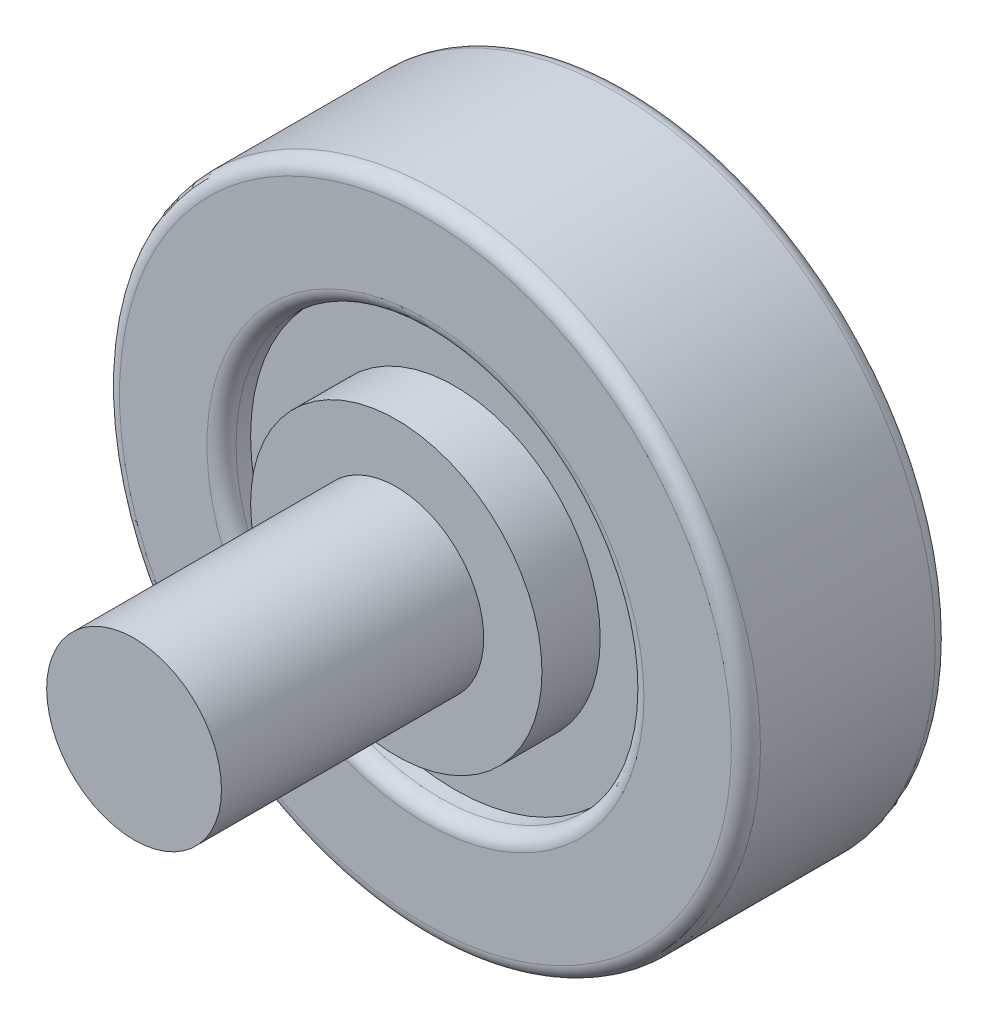
ISO-10303-21;
HEADER;
FILE_DESCRIPTION(('STEP AP214'),'2;1');
FILE_NAME('part.step','',(''),(''),'','','');
FILE_SCHEMA(('AUTOMOTIVE_DESIGN { 1 0 10303 214 1 1 1 1 }'));
ENDSEC;
DATA;
#1=APPLICATION_CONTEXT('core data for automotive mechanical design processes');
#2=APPLICATION_PROTOCOL_DEFINITION('international standard','automotive_design',2000,#1);
#3=PRODUCT_CONTEXT('',#1,'mechanical');
#4=PRODUCT('Part','Part','',(#3));
#5=PRODUCT_RELATED_PRODUCT_CATEGORY('part','',(#4));
#6=PRODUCT_DEFINITION_FORMATION('','',#4);
#7=PRODUCT_DEFINITION_CONTEXT('part definition',#1,'design');
#8=PRODUCT_DEFINITION('design','',#6,#7);
#9=PRODUCT_DEFINITION_SHAPE('','',#8);
#10=(LENGTH_UNIT() NAMED_UNIT(*) SI_UNIT(.MILLI.,.METRE.));
#11=(NAMED_UNIT(*) PLANE_ANGLE_UNIT() SI_UNIT($,.RADIAN.));
#12=(NAMED_UNIT(*) SI_UNIT($,.STERADIAN.) SOLID_ANGLE_UNIT());
#13=UNCERTAINTY_MEASURE_WITH_UNIT(LENGTH_MEASURE(1.E-05),#10,'distance_accuracy_value','');
#14=(GEOMETRIC_REPRESENTATION_CONTEXT(3) GLOBAL_UNCERTAINTY_ASSIGNED_CONTEXT((#13)) GLOBAL_UNIT_ASSIGNED_CONTEXT((#10,
#11,#12)) REPRESENTATION_CONTEXT('',''));
#15=CARTESIAN_POINT('',(0.,0.,0.));
#16=DIRECTION('',(0.,0.,1.));
#17=DIRECTION('',(1.,0.,0.));
#18=AXIS2_PLACEMENT_3D('',#15,#16,#17);
#19=CARTESIAN_POINT('',(0.,0.,4.5));
#20=DIRECTION('',(0.,0.,-1.));
#21=DIRECTION('',(-1.,0.,0.));
#22=AXIS2_PLACEMENT_3D('',#19,#20,#21);
#23=CYLINDRICAL_SURFACE('',#22,5.);
#24=CARTESIAN_POINT('',(0.,0.,4.5));
#25=DIRECTION('',(0.,0.,1.));
#26=DIRECTION('',(1.,0.,0.));
#27=AXIS2_PLACEMENT_3D('',#24,#25,#26);
#28=CIRCLE('',#27,5.);
#29=CARTESIAN_POINT('',(5.,0.,4.5));
#30=VERTEX_POINT('',#29);
#31=EDGE_CURVE('E11',#30,#30,#28,.T.);
#32=ORIENTED_EDGE('',*,*,#31,.F.);
#33=EDGE_LOOP('',(#32));
#34=FACE_BOUND('',#33,.T.);
#35=CARTESIAN_POINT('',(0.,0.,2.5));
#36=DIRECTION('',(0.,0.,1.));
#37=DIRECTION('',(1.,0.,0.));
#38=AXIS2_PLACEMENT_3D('',#35,#36,#37);
#39=CIRCLE('',#38,5.);
#40=CARTESIAN_POINT('',(5.,0.,2.5));
#41=VERTEX_POINT('',#40);
#42=EDGE_CURVE('E50',#41,#41,#39,.T.);
#43=ORIENTED_EDGE('',*,*,#42,.T.);
#44=EDGE_LOOP('',(#43));
#45=FACE_BOUND('',#44,.T.);
#46=ADVANCED_FACE('F47',(#34,#45),#23,.T.);
#47=CARTESIAN_POINT('',(0.,0.,4.5));
#48=DIRECTION('',(0.,0.,1.));
#49=DIRECTION('',(1.,0.,0.));
#50=AXIS2_PLACEMENT_3D('',#47,#48,#49);
#51=PLANE('',#50);
#52=ORIENTED_EDGE('',*,*,#31,.T.);
#53=EDGE_LOOP('',(#52));
#54=FACE_BOUND('',#53,.T.);
#55=ADVANCED_FACE('F62',(#54),#51,.T.);
#56=CARTESIAN_POINT('',(0.,0.,2.5));
#57=DIRECTION('',(0.,0.,1.));
#58=DIRECTION('',(1.,0.,0.));
#59=AXIS2_PLACEMENT_3D('',#56,#57,#58);
#60=PLANE('',#59);
#61=ORIENTED_EDGE('',*,*,#42,.F.);
#62=EDGE_LOOP('',(#61));
#63=FACE_BOUND('',#62,.T.);
#64=ADVANCED_FACE('F60',(#63),#60,.F.);
#65=CLOSED_SHELL('',(#46,#55,#64));
#66=MANIFOLD_SOLID_BREP('B2',#65);
#67=CARTESIAN_POINT('',(0.,0.,13.5));
#68=DIRECTION('',(0.,0.,1.));
#69=DIRECTION('',(1.,0.,0.));
#70=AXIS2_PLACEMENT_3D('',#67,#68,#69);
#71=PLANE('',#70);
#72=CARTESIAN_POINT('',(0.,0.,13.5));
#73=DIRECTION('',(0.,0.,1.));
#74=DIRECTION('',(1.,0.,0.));
#75=AXIS2_PLACEMENT_3D('',#72,#73,#74);
#76=CIRCLE('',#75,3.);
#77=CARTESIAN_POINT('',(3.,0.,13.5));
#78=VERTEX_POINT('',#77);
#79=EDGE_CURVE('E46',#78,#78,#76,.F.);
#80=ORIENTED_EDGE('',*,*,#79,.F.);
#81=EDGE_LOOP('',(#80));
#82=FACE_BOUND('',#81,.T.);
#83=ADVANCED_FACE('F96',(#82),#71,.T.);
#84=CARTESIAN_POINT('',(0.,0.,-2.5));
#85=DIRECTION('',(0.,0.,-1.));
#86=DIRECTION('',(-1.,0.,0.));
#87=AXIS2_PLACEMENT_3D('',#84,#85,#86);
#88=PLANE('',#87);
#89=CARTESIAN_POINT('',(0.,0.,-2.5));
#90=DIRECTION('',(0.,0.,-1.));
#91=DIRECTION('',(-1.,0.,0.));
#92=AXIS2_PLACEMENT_3D('',#89,#90,#91);
#93=CIRCLE('',#92,3.);
#94=CARTESIAN_POINT('',(-3.,0.,-2.5));
#95=VERTEX_POINT('',#94);
#96=EDGE_CURVE('E102',#95,#95,#93,.T.);
#97=ORIENTED_EDGE('',*,*,#96,.T.);
#98=EDGE_LOOP('',(#97));
#99=FACE_BOUND('',#98,.T.);
#100=ADVANCED_FACE('F108',(#99),#88,.T.);
#101=CARTESIAN_POINT('',(0.,0.,31.9852813742386));
#102=DIRECTION('',(0.,0.,-1.));
#103=DIRECTION('',(-1.,0.,0.));
#104=AXIS2_PLACEMENT_3D('',#101,#102,#103);
#105=CYLINDRICAL_SURFACE('',#104,3.);
#106=ORIENTED_EDGE('',*,*,#96,.F.);
#107=EDGE_LOOP('',(#106));
#108=FACE_BOUND('',#107,.T.);
#109=ORIENTED_EDGE('',*,*,#79,.T.);
#110=EDGE_LOOP('',(#109));
#111=FACE_BOUND('',#110,.T.);
#112=ADVANCED_FACE('F110',(#108,#111),#105,.T.);
#113=CLOSED_SHELL('',(#83,#100,#112));
#114=MANIFOLD_SOLID_BREP('B6',#113);
#115=CARTESIAN_POINT('',(0.,0.,-2.5));
#116=DIRECTION('',(0.,0.,1.));
#117=DIRECTION('',(1.,0.,0.));
#118=AXIS2_PLACEMENT_3D('',#115,#116,#117);
#119=CYLINDRICAL_SURFACE('',#118,7.);
#120=CARTESIAN_POINT('',(0.,0.,3.));
#121=DIRECTION('',(0.,0.,1.));
#122=DIRECTION('',(1.,0.,0.));
#123=AXIS2_PLACEMENT_3D('',#120,#121,#122);
#124=CIRCLE('',#123,7.);
#125=CARTESIAN_POINT('',(7.,0.,3.));
#126=VERTEX_POINT('',#125);
#127=EDGE_CURVE('E171',#126,#126,#124,.T.);
#128=ORIENTED_EDGE('',*,*,#127,.T.);
#129=EDGE_LOOP('',(#128));
#130=FACE_BOUND('',#129,.T.);
#131=CARTESIAN_POINT('',(0.,0.,-3.));
#132=DIRECTION('',(0.,0.,1.));
#133=DIRECTION('',(1.,0.,0.));
#134=AXIS2_PLACEMENT_3D('',#131,#132,#133);
#135=CIRCLE('',#134,7.);
#136=CARTESIAN_POINT('',(7.,0.,-3.));
#137=VERTEX_POINT('',#136);
#138=EDGE_CURVE('E174',#137,#137,#135,.F.);
#139=ORIENTED_EDGE('',*,*,#138,.T.);
#140=EDGE_LOOP('',(#139));
#141=FACE_BOUND('',#140,.T.);
#142=ADVANCED_FACE('F145',(#130,#141),#119,.F.);
#143=CARTESIAN_POINT('',(0.,0.,3.5));
#144=DIRECTION('',(0.,0.,-1.));
#145=DIRECTION('',(-1.,0.,0.));
#146=AXIS2_PLACEMENT_3D('',#143,#144,#145);
#147=CYLINDRICAL_SURFACE('',#146,11.);
#148=CARTESIAN_POINT('',(0.,0.,3.));
#149=DIRECTION('',(0.,0.,1.));
#150=DIRECTION('',(1.,0.,0.));
#151=AXIS2_PLACEMENT_3D('',#148,#149,#150);
#152=CIRCLE('',#151,11.);
#153=CARTESIAN_POINT('',(11.,0.,3.));
#154=VERTEX_POINT('',#153);
#155=EDGE_CURVE('E156',#154,#154,#152,.F.);
#156=ORIENTED_EDGE('',*,*,#155,.T.);
#157=EDGE_LOOP('',(#156));
#158=FACE_BOUND('',#157,.T.);
#159=CARTESIAN_POINT('',(0.,0.,-3.));
#160=DIRECTION('',(0.,0.,1.));
#161=DIRECTION('',(1.,0.,0.));
#162=AXIS2_PLACEMENT_3D('',#159,#160,#161);
#163=CIRCLE('',#162,11.);
#164=CARTESIAN_POINT('',(11.,0.,-3.));
#165=VERTEX_POINT('',#164);
#166=EDGE_CURVE('E160',#165,#165,#163,.T.);
#167=ORIENTED_EDGE('',*,*,#166,.T.);
#168=EDGE_LOOP('',(#167));
#169=FACE_BOUND('',#168,.T.);
#170=ADVANCED_FACE('F187',(#158,#169),#147,.T.);
#171=CARTESIAN_POINT('',(0.,0.,3.5));
#172=DIRECTION('',(0.,0.,1.));
#173=DIRECTION('',(1.,0.,0.));
#174=AXIS2_PLACEMENT_3D('',#171,#172,#173);
#175=PLANE('',#174);
#176=CARTESIAN_POINT('',(0.,0.,3.5));
#177=DIRECTION('',(0.,0.,1.));
#178=DIRECTION('',(1.,0.,0.));
#179=AXIS2_PLACEMENT_3D('',#176,#177,#178);
#180=CIRCLE('',#179,7.5);
#181=CARTESIAN_POINT('',(7.5,0.,3.5));
#182=VERTEX_POINT('',#181);
#183=EDGE_CURVE('E165',#182,#182,#180,.F.);
#184=ORIENTED_EDGE('',*,*,#183,.T.);
#185=EDGE_LOOP('',(#184));
#186=FACE_BOUND('',#185,.T.);
#187=CARTESIAN_POINT('',(0.,0.,3.5));
#188=DIRECTION('',(0.,0.,1.));
#189=DIRECTION('',(1.,0.,0.));
#190=AXIS2_PLACEMENT_3D('',#187,#188,#189);
#191=CIRCLE('',#190,10.5);
#192=CARTESIAN_POINT('',(10.5,0.,3.5));
#193=VERTEX_POINT('',#192);
#194=EDGE_CURVE('E168',#193,#193,#191,.T.);
#195=ORIENTED_EDGE('',*,*,#194,.T.);
#196=EDGE_LOOP('',(#195));
#197=FACE_BOUND('',#196,.T.);
#198=ADVANCED_FACE('F189',(#186,#197),#175,.T.);
#199=CARTESIAN_POINT('',(0.,0.,-3.5));
#200=DIRECTION('',(0.,0.,1.));
#201=DIRECTION('',(1.,0.,0.));
#202=AXIS2_PLACEMENT_3D('',#199,#200,#201);
#203=PLANE('',#202);
#204=CARTESIAN_POINT('',(0.,0.,-3.5));
#205=DIRECTION('',(0.,0.,1.));
#206=DIRECTION('',(1.,0.,0.));
#207=AXIS2_PLACEMENT_3D('',#204,#205,#206);
#208=CIRCLE('',#207,10.5);
#209=CARTESIAN_POINT('',(10.5,0.,-3.5));
#210=VERTEX_POINT('',#209);
#211=EDGE_CURVE('E95',#210,#210,#208,.F.);
#212=ORIENTED_EDGE('',*,*,#211,.T.);
#213=EDGE_LOOP('',(#212));
#214=FACE_BOUND('',#213,.T.);
#215=CARTESIAN_POINT('',(0.,0.,-3.5));
#216=DIRECTION('',(0.,0.,1.));
#217=DIRECTION('',(1.,0.,0.));
#218=AXIS2_PLACEMENT_3D('',#215,#216,#217);
#219=CIRCLE('',#218,7.5);
#220=CARTESIAN_POINT('',(7.5,0.,-3.5));
#221=VERTEX_POINT('',#220);
#222=EDGE_CURVE('E152',#221,#221,#219,.T.);
#223=ORIENTED_EDGE('',*,*,#222,.T.);
#224=EDGE_LOOP('',(#223));
#225=FACE_BOUND('',#224,.T.);
#226=ADVANCED_FACE('F196',(#214,#225),#203,.F.);
#227=CARTESIAN_POINT('',(0.,0.,3.));
#228=DIRECTION('',(0.,0.,1.));
#229=DIRECTION('',(1.,0.,0.));
#230=AXIS2_PLACEMENT_3D('',#227,#228,#229);
#231=TOROIDAL_SURFACE('',#230,7.5,0.5);
#232=ORIENTED_EDGE('',*,*,#183,.F.);
#233=EDGE_LOOP('',(#232));
#234=FACE_BOUND('',#233,.T.);
#235=ORIENTED_EDGE('',*,*,#127,.F.);
#236=EDGE_LOOP('',(#235));
#237=FACE_BOUND('',#236,.T.);
#238=ADVANCED_FACE('F201',(#234,#237),#231,.T.);
#239=CARTESIAN_POINT('',(0.,0.,3.));
#240=DIRECTION('',(0.,0.,1.));
#241=DIRECTION('',(1.,0.,0.));
#242=AXIS2_PLACEMENT_3D('',#239,#240,#241);
#243=TOROIDAL_SURFACE('',#242,10.5,0.5);
#244=ORIENTED_EDGE('',*,*,#155,.F.);
#245=EDGE_LOOP('',(#244));
#246=FACE_BOUND('',#245,.T.);
#247=ORIENTED_EDGE('',*,*,#194,.F.);
#248=EDGE_LOOP('',(#247));
#249=FACE_BOUND('',#248,.T.);
#250=ADVANCED_FACE('F185',(#246,#249),#243,.T.);
#251=CARTESIAN_POINT('',(0.,0.,-3.));
#252=DIRECTION('',(0.,0.,1.));
#253=DIRECTION('',(1.,0.,0.));
#254=AXIS2_PLACEMENT_3D('',#251,#252,#253);
#255=TOROIDAL_SURFACE('',#254,10.5,0.5);
#256=ORIENTED_EDGE('',*,*,#211,.F.);
#257=EDGE_LOOP('',(#256));
#258=FACE_BOUND('',#257,.T.);
#259=ORIENTED_EDGE('',*,*,#166,.F.);
#260=EDGE_LOOP('',(#259));
#261=FACE_BOUND('',#260,.T.);
#262=ADVANCED_FACE('F181',(#258,#261),#255,.T.);
#263=CARTESIAN_POINT('',(0.,0.,-3.));
#264=DIRECTION('',(0.,0.,1.));
#265=DIRECTION('',(1.,0.,0.));
#266=AXIS2_PLACEMENT_3D('',#263,#264,#265);
#267=TOROIDAL_SURFACE('',#266,7.5,0.5);
#268=ORIENTED_EDGE('',*,*,#138,.F.);
#269=EDGE_LOOP('',(#268));
#270=FACE_BOUND('',#269,.T.);
#271=ORIENTED_EDGE('',*,*,#222,.F.);
#272=EDGE_LOOP('',(#271));
#273=FACE_BOUND('',#272,.T.);
#274=ADVANCED_FACE('F147',(#270,#273),#267,.T.);
#275=CLOSED_SHELL('',(#142,#170,#198,#226,#238,#250,#262,#274));
#276=MANIFOLD_SOLID_BREP('B41',#275);
#277=CARTESIAN_POINT('',(0.,0.,-2.5));
#278=DIRECTION('',(0.,0.,1.));
#279=DIRECTION('',(1.,0.,0.));
#280=AXIS2_PLACEMENT_3D('',#277,#278,#279);
#281=CYLINDRICAL_SURFACE('',#280,7.);
#282=CARTESIAN_POINT('',(0.,0.,2.5));
#283=DIRECTION('',(0.,0.,1.));
#284=DIRECTION('',(1.,0.,0.));
#285=AXIS2_PLACEMENT_3D('',#282,#283,#284);
#286=CIRCLE('',#285,7.);
#287=CARTESIAN_POINT('',(7.,0.,2.5));
#288=VERTEX_POINT('',#287);
#289=EDGE_CURVE('E294',#288,#288,#286,.T.);
#290=ORIENTED_EDGE('',*,*,#289,.F.);
#291=EDGE_LOOP('',(#290));
#292=FACE_BOUND('',#291,.T.);
#293=CARTESIAN_POINT('',(0.,0.,-2.5));
#294=DIRECTION('',(0.,0.,1.));
#295=DIRECTION('',(1.,0.,0.));
#296=AXIS2_PLACEMENT_3D('',#293,#294,#295);
#297=CIRCLE('',#296,7.);
#298=CARTESIAN_POINT('',(7.,0.,-2.5));
#299=VERTEX_POINT('',#298);
#300=EDGE_CURVE('E144',#299,#299,#297,.T.);
#301=ORIENTED_EDGE('',*,*,#300,.T.);
#302=EDGE_LOOP('',(#301));
#303=FACE_BOUND('',#302,.T.);
#304=ADVANCED_FACE('F279',(#292,#303),#281,.T.);
#305=CARTESIAN_POINT('',(0.,0.,3.5));
#306=DIRECTION('',(0.,0.,-1.));
#307=DIRECTION('',(-1.,0.,0.));
#308=AXIS2_PLACEMENT_3D('',#305,#306,#307);
#309=CYLINDRICAL_SURFACE('',#308,2.5);
#310=CARTESIAN_POINT('',(0.,0.,2.5));
#311=DIRECTION('',(0.,0.,1.));
#312=DIRECTION('',(1.,0.,0.));
#313=AXIS2_PLACEMENT_3D('',#310,#311,#312);
#314=CIRCLE('',#313,2.5);
#315=CARTESIAN_POINT('',(2.5,0.,2.5));
#316=VERTEX_POINT('',#315);
#317=EDGE_CURVE('E287',#316,#316,#314,.T.);
#318=ORIENTED_EDGE('',*,*,#317,.T.);
#319=EDGE_LOOP('',(#318));
#320=FACE_BOUND('',#319,.T.);
#321=CARTESIAN_POINT('',(0.,0.,-2.5));
#322=DIRECTION('',(0.,0.,-1.));
#323=DIRECTION('',(-1.,0.,0.));
#324=AXIS2_PLACEMENT_3D('',#321,#322,#323);
#325=CIRCLE('',#324,2.5);
#326=CARTESIAN_POINT('',(-2.5,0.,-2.5));
#327=VERTEX_POINT('',#326);
#328=EDGE_CURVE('E282',#327,#327,#325,.T.);
#329=ORIENTED_EDGE('',*,*,#328,.T.);
#330=EDGE_LOOP('',(#329));
#331=FACE_BOUND('',#330,.T.);
#332=ADVANCED_FACE('F302',(#320,#331),#309,.F.);
#333=CARTESIAN_POINT('',(0.,0.,-2.5));
#334=DIRECTION('',(0.,0.,-1.));
#335=DIRECTION('',(1.,0.,0.));
#336=AXIS2_PLACEMENT_3D('',#333,#334,#335);
#337=PLANE('',#336);
#338=ORIENTED_EDGE('',*,*,#328,.F.);
#339=EDGE_LOOP('',(#338));
#340=FACE_BOUND('',#339,.T.);
#341=ORIENTED_EDGE('',*,*,#300,.F.);
#342=EDGE_LOOP('',(#341));
#343=FACE_BOUND('',#342,.T.);
#344=ADVANCED_FACE('F304',(#340,#343),#337,.T.);
#345=CARTESIAN_POINT('',(0.,0.,2.5));
#346=DIRECTION('',(0.,0.,1.));
#347=DIRECTION('',(1.,0.,0.));
#348=AXIS2_PLACEMENT_3D('',#345,#346,#347);
#349=PLANE('',#348);
#350=ORIENTED_EDGE('',*,*,#317,.F.);
#351=EDGE_LOOP('',(#350));
#352=FACE_BOUND('',#351,.T.);
#353=ORIENTED_EDGE('',*,*,#289,.T.);
#354=EDGE_LOOP('',(#353));
#355=FACE_BOUND('',#354,.T.);
#356=ADVANCED_FACE('F307',(#352,#355),#349,.T.);
#357=CLOSED_SHELL('',(#304,#332,#344,#356));
#358=MANIFOLD_SOLID_BREP('B90',#357);
#359=ADVANCED_BREP_SHAPE_REPRESENTATION('',(#18,#66,#114,#276,#358),#14);
#360=SHAPE_DEFINITION_REPRESENTATION(#9,#359);
ENDSEC;
END-ISO-10303-21;
